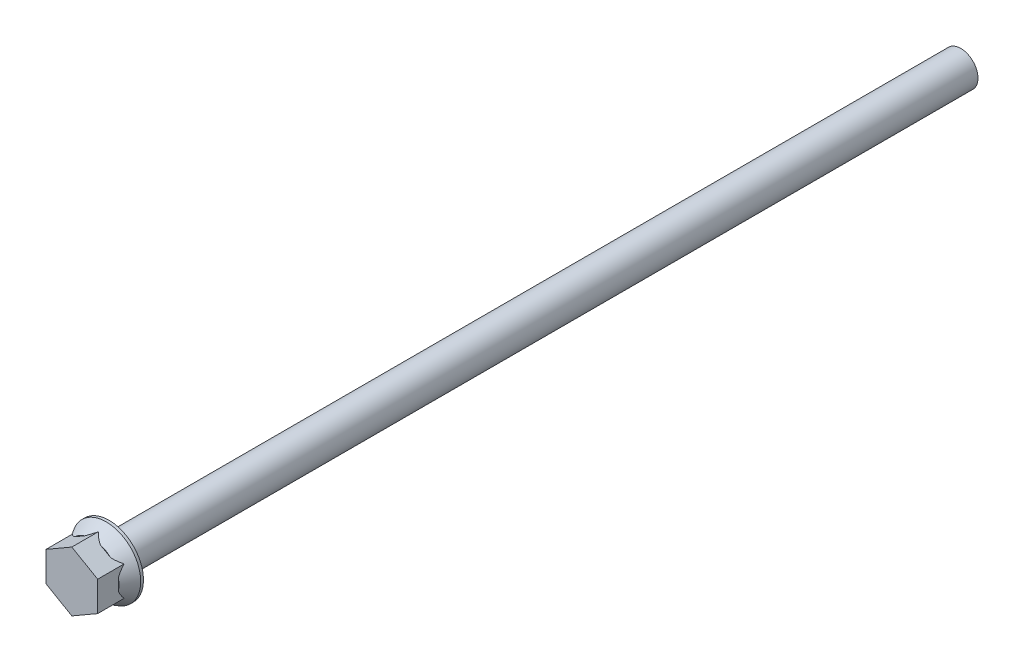
ISO-10303-21;
HEADER;
FILE_DESCRIPTION(('STEP AP214'),'2;1');
FILE_NAME('part.step','',(''),(''),'','','');
FILE_SCHEMA(('AUTOMOTIVE_DESIGN { 1 0 10303 214 1 1 1 1 }'));
ENDSEC;
DATA;
#1=APPLICATION_CONTEXT('core data for automotive mechanical design processes');
#2=APPLICATION_PROTOCOL_DEFINITION('international standard','automotive_design',2000,#1);
#3=PRODUCT_CONTEXT('',#1,'mechanical');
#4=PRODUCT('Part','Part','',(#3));
#5=PRODUCT_RELATED_PRODUCT_CATEGORY('part','',(#4));
#6=PRODUCT_DEFINITION_FORMATION('','',#4);
#7=PRODUCT_DEFINITION_CONTEXT('part definition',#1,'design');
#8=PRODUCT_DEFINITION('design','',#6,#7);
#9=PRODUCT_DEFINITION_SHAPE('','',#8);
#10=(LENGTH_UNIT() NAMED_UNIT(*) SI_UNIT(.MILLI.,.METRE.));
#11=(NAMED_UNIT(*) PLANE_ANGLE_UNIT() SI_UNIT($,.RADIAN.));
#12=(NAMED_UNIT(*) SI_UNIT($,.STERADIAN.) SOLID_ANGLE_UNIT());
#13=UNCERTAINTY_MEASURE_WITH_UNIT(LENGTH_MEASURE(1.E-05),#10,'distance_accuracy_value','');
#14=(GEOMETRIC_REPRESENTATION_CONTEXT(3) GLOBAL_UNCERTAINTY_ASSIGNED_CONTEXT((#13)) GLOBAL_UNIT_ASSIGNED_CONTEXT((#10,
#11,#12)) REPRESENTATION_CONTEXT('',''));
#15=CARTESIAN_POINT('',(0.,0.,0.));
#16=DIRECTION('',(0.,0.,1.));
#17=DIRECTION('',(1.,0.,0.));
#18=AXIS2_PLACEMENT_3D('',#15,#16,#17);
#19=CARTESIAN_POINT('',(0.,0.,3.048));
#20=DIRECTION('',(0.,0.,1.));
#21=DIRECTION('',(1.,0.,0.));
#22=AXIS2_PLACEMENT_3D('',#19,#20,#21);
#23=PLANE('',#22);
#24=DIRECTION('',(0.,1.,0.));
#25=VECTOR('',#24,1.);
#26=CARTESIAN_POINT('',(4.7625,-2.74963065701559,3.048));
#27=LINE('',#26,#25);
#28=CARTESIAN_POINT('',(4.7625,-1.08049160099193,3.048));
#29=VERTEX_POINT('',#28);
#30=CARTESIAN_POINT('',(4.7625,1.08049160099193,3.048));
#31=VERTEX_POINT('',#30);
#32=EDGE_CURVE('E140',#29,#31,#27,.T.);
#33=ORIENTED_EDGE('',*,*,#32,.F.);
#34=CARTESIAN_POINT('',(0.,0.,3.048));
#35=DIRECTION('',(0.,0.,1.));
#36=DIRECTION('',(1.,0.,0.));
#37=AXIS2_PLACEMENT_3D('',#34,#35,#36);
#38=CIRCLE('',#37,4.88353031625832);
#39=EDGE_CURVE('E168',#29,#31,#38,.T.);
#40=ORIENTED_EDGE('',*,*,#39,.T.);
#41=EDGE_LOOP('',(#33,#40));
#42=FACE_BOUND('',#41,.T.);
#43=ADVANCED_FACE('F32',(#42),#23,.T.);
#44=DIRECTION('',(-0.866025403784439,0.5,0.));
#45=VECTOR('',#44,1.);
#46=CARTESIAN_POINT('',(4.7625,2.74963065701559,3.048));
#47=LINE('',#46,#45);
#48=CARTESIAN_POINT('',(3.31698317503473,3.58420018502743,3.048));
#49=VERTEX_POINT('',#48);
#50=CARTESIAN_POINT('',(1.44551682496527,4.66469178601936,3.048));
#51=VERTEX_POINT('',#50);
#52=EDGE_CURVE('E365',#49,#51,#47,.T.);
#53=ORIENTED_EDGE('',*,*,#52,.F.);
#54=CARTESIAN_POINT('',(0.,0.,3.048));
#55=DIRECTION('',(0.,0.,1.));
#56=DIRECTION('',(1.,0.,0.));
#57=AXIS2_PLACEMENT_3D('',#54,#55,#56);
#58=CIRCLE('',#57,4.88353031625832);
#59=EDGE_CURVE('E166',#49,#51,#58,.T.);
#60=ORIENTED_EDGE('',*,*,#59,.T.);
#61=EDGE_LOOP('',(#53,#60));
#62=FACE_BOUND('',#61,.T.);
#63=ADVANCED_FACE('F313',(#62),#23,.T.);
#64=DIRECTION('',(-0.866025403784439,-0.5,0.));
#65=VECTOR('',#64,1.);
#66=CARTESIAN_POINT('',(0.,5.49926131403118,3.048));
#67=LINE('',#66,#65);
#68=CARTESIAN_POINT('',(-1.44551682496527,4.66469178601935,3.048));
#69=VERTEX_POINT('',#68);
#70=CARTESIAN_POINT('',(-3.31698317503473,3.58420018502742,3.048));
#71=VERTEX_POINT('',#70);
#72=EDGE_CURVE('E362',#69,#71,#67,.T.);
#73=ORIENTED_EDGE('',*,*,#72,.F.);
#74=CARTESIAN_POINT('',(0.,0.,3.048));
#75=DIRECTION('',(0.,0.,1.));
#76=DIRECTION('',(1.,0.,0.));
#77=AXIS2_PLACEMENT_3D('',#74,#75,#76);
#78=CIRCLE('',#77,4.88353031625832);
#79=EDGE_CURVE('E164',#69,#71,#78,.T.);
#80=ORIENTED_EDGE('',*,*,#79,.T.);
#81=EDGE_LOOP('',(#73,#80));
#82=FACE_BOUND('',#81,.T.);
#83=ADVANCED_FACE('F318',(#82),#23,.T.);
#84=DIRECTION('',(0.,-1.,0.));
#85=VECTOR('',#84,1.);
#86=CARTESIAN_POINT('',(-4.7625,2.74963065701559,3.048));
#87=LINE('',#86,#85);
#88=CARTESIAN_POINT('',(-4.7625,1.08049160099193,3.048));
#89=VERTEX_POINT('',#88);
#90=CARTESIAN_POINT('',(-4.7625,-1.08049160099193,3.048));
#91=VERTEX_POINT('',#90);
#92=EDGE_CURVE('E347',#89,#91,#87,.T.);
#93=ORIENTED_EDGE('',*,*,#92,.F.);
#94=CARTESIAN_POINT('',(0.,0.,3.048));
#95=DIRECTION('',(0.,0.,1.));
#96=DIRECTION('',(1.,0.,0.));
#97=AXIS2_PLACEMENT_3D('',#94,#95,#96);
#98=CIRCLE('',#97,4.88353031625832);
#99=EDGE_CURVE('E162',#89,#91,#98,.T.);
#100=ORIENTED_EDGE('',*,*,#99,.T.);
#101=EDGE_LOOP('',(#93,#100));
#102=FACE_BOUND('',#101,.T.);
#103=ADVANCED_FACE('F372',(#102),#23,.T.);
#104=DIRECTION('',(0.866025403784439,-0.5,0.));
#105=VECTOR('',#104,1.);
#106=CARTESIAN_POINT('',(-4.7625,-2.74963065701559,3.048));
#107=LINE('',#106,#105);
#108=CARTESIAN_POINT('',(-3.31698317503473,-3.58420018502743,3.048));
#109=VERTEX_POINT('',#108);
#110=CARTESIAN_POINT('',(-1.44551682496527,-4.66469178601935,3.048));
#111=VERTEX_POINT('',#110);
#112=EDGE_CURVE('E355',#109,#111,#107,.T.);
#113=ORIENTED_EDGE('',*,*,#112,.F.);
#114=CARTESIAN_POINT('',(0.,0.,3.048));
#115=DIRECTION('',(0.,0.,1.));
#116=DIRECTION('',(1.,0.,0.));
#117=AXIS2_PLACEMENT_3D('',#114,#115,#116);
#118=CIRCLE('',#117,4.88353031625832);
#119=EDGE_CURVE('E160',#109,#111,#118,.T.);
#120=ORIENTED_EDGE('',*,*,#119,.T.);
#121=EDGE_LOOP('',(#113,#120));
#122=FACE_BOUND('',#121,.T.);
#123=ADVANCED_FACE('F301',(#122),#23,.T.);
#124=DIRECTION('',(0.866025403784438,0.5,0.));
#125=VECTOR('',#124,1.);
#126=CARTESIAN_POINT('',(0.,-5.49926131403119,3.048));
#127=LINE('',#126,#125);
#128=CARTESIAN_POINT('',(1.44551682496528,-4.66469178601935,3.048));
#129=VERTEX_POINT('',#128);
#130=CARTESIAN_POINT('',(3.31698317503473,-3.58420018502743,3.048));
#131=VERTEX_POINT('',#130);
#132=EDGE_CURVE('E323',#129,#131,#127,.T.);
#133=ORIENTED_EDGE('',*,*,#132,.F.);
#134=CARTESIAN_POINT('',(0.,0.,3.048));
#135=DIRECTION('',(0.,0.,1.));
#136=DIRECTION('',(1.,0.,0.));
#137=AXIS2_PLACEMENT_3D('',#134,#135,#136);
#138=CIRCLE('',#137,4.88353031625832);
#139=EDGE_CURVE('E158',#129,#131,#138,.T.);
#140=ORIENTED_EDGE('',*,*,#139,.T.);
#141=EDGE_LOOP('',(#133,#140));
#142=FACE_BOUND('',#141,.T.);
#143=ADVANCED_FACE('F298',(#142),#23,.T.);
#144=CARTESIAN_POINT('',(0.,0.,-157.48));
#145=DIRECTION('',(0.,0.,1.));
#146=DIRECTION('',(1.,0.,0.));
#147=AXIS2_PLACEMENT_3D('',#144,#145,#146);
#148=CYLINDRICAL_SURFACE('',#147,3.175);
#149=CARTESIAN_POINT('',(0.,0.,-157.040059094878));
#150=DIRECTION('',(0.,0.,1.));
#151=DIRECTION('',(1.,0.,0.));
#152=AXIS2_PLACEMENT_3D('',#149,#150,#151);
#153=CIRCLE('',#152,3.175);
#154=CARTESIAN_POINT('',(3.175,0.,-157.040059094878));
#155=VERTEX_POINT('',#154);
#156=EDGE_CURVE('E40',#155,#155,#153,.T.);
#157=ORIENTED_EDGE('',*,*,#156,.T.);
#158=EDGE_LOOP('',(#157));
#159=FACE_BOUND('',#158,.T.);
#160=CARTESIAN_POINT('',(0.,0.,0.));
#161=DIRECTION('',(0.,0.,1.));
#162=DIRECTION('',(1.,0.,0.));
#163=AXIS2_PLACEMENT_3D('',#160,#161,#162);
#164=CIRCLE('',#163,3.175);
#165=CARTESIAN_POINT('',(3.175,0.,0.));
#166=VERTEX_POINT('',#165);
#167=EDGE_CURVE('E150',#166,#166,#164,.T.);
#168=ORIENTED_EDGE('',*,*,#167,.F.);
#169=EDGE_LOOP('',(#168));
#170=FACE_BOUND('',#169,.T.);
#171=ADVANCED_FACE('F34',(#159,#170),#148,.T.);
#172=CARTESIAN_POINT('',(0.,0.,-157.48));
#173=DIRECTION('',(0.,0.,1.));
#174=DIRECTION('',(1.,0.,0.));
#175=AXIS2_PLACEMENT_3D('',#172,#173,#174);
#176=PLANE('',#175);
#177=CARTESIAN_POINT('',(0.,0.,-157.48));
#178=DIRECTION('',(0.,0.,1.));
#179=DIRECTION('',(1.,0.,0.));
#180=AXIS2_PLACEMENT_3D('',#177,#178,#179);
#181=CIRCLE('',#180,2.413);
#182=CARTESIAN_POINT('',(2.413,0.,-157.48));
#183=VERTEX_POINT('',#182);
#184=EDGE_CURVE('E11',#183,#183,#181,.F.);
#185=ORIENTED_EDGE('',*,*,#184,.T.);
#186=EDGE_LOOP('',(#185));
#187=FACE_BOUND('',#186,.T.);
#188=ADVANCED_FACE('F304',(#187),#176,.F.);
#189=CARTESIAN_POINT('',(0.,0.,3.048));
#190=DIRECTION('',(0.,0.,-1.));
#191=DIRECTION('',(-1.,0.,0.));
#192=AXIS2_PLACEMENT_3D('',#189,#190,#191);
#193=CYLINDRICAL_SURFACE('',#192,6.35);
#194=CARTESIAN_POINT('',(0.,0.,0.507999999999989));
#195=DIRECTION('',(0.,0.,1.));
#196=DIRECTION('',(1.,0.,0.));
#197=AXIS2_PLACEMENT_3D('',#194,#195,#196);
#198=CIRCLE('',#197,6.35);
#199=CARTESIAN_POINT('',(-6.35,0.,0.507999999999989));
#200=VERTEX_POINT('',#199);
#201=EDGE_CURVE('E171',#200,#200,#198,.F.);
#202=CARTESIAN_POINT('',(0.,0.,0.));
#203=DIRECTION('',(0.,0.,1.));
#204=DIRECTION('',(1.,0.,0.));
#205=AXIS2_PLACEMENT_3D('',#202,#203,#204);
#206=CIRCLE('',#205,6.35);
#207=CARTESIAN_POINT('',(-6.35,0.,0.));
#208=VERTEX_POINT('',#207);
#209=EDGE_CURVE('E147',#208,#208,#206,.T.);
#210=CARTESIAN_POINT('',(-6.35,0.,0.507999999999989));
#211=CARTESIAN_POINT('',(-6.35,0.,0.502708333333323));
#212=CARTESIAN_POINT('',(-6.35,0.,0.497416666666656));
#213=CARTESIAN_POINT('',(-6.35,0.,0.486833333333323));
#214=CARTESIAN_POINT('',(-6.35,0.,0.481541666666657));
#215=CARTESIAN_POINT('',(-6.35,0.,0.470958333333323));
#216=CARTESIAN_POINT('',(-6.35,0.,0.465666666666657));
#217=CARTESIAN_POINT('',(-6.35,0.,0.455083333333324));
#218=CARTESIAN_POINT('',(-6.35,0.,0.449791666666657));
#219=CARTESIAN_POINT('',(-6.35,0.,0.439208333333324));
#220=CARTESIAN_POINT('',(-6.35,0.,0.433916666666658));
#221=CARTESIAN_POINT('',(-6.35,0.,0.423333333333324));
#222=CARTESIAN_POINT('',(-6.35,0.,0.418041666666658));
#223=CARTESIAN_POINT('',(-6.35,0.,0.407458333333325));
#224=CARTESIAN_POINT('',(-6.35,0.,0.402166666666658));
#225=CARTESIAN_POINT('',(-6.35,0.,0.391583333333325));
#226=CARTESIAN_POINT('',(-6.35,0.,0.386291666666659));
#227=CARTESIAN_POINT('',(-6.35,0.,0.375708333333325));
#228=CARTESIAN_POINT('',(-6.35,0.,0.370416666666659));
#229=CARTESIAN_POINT('',(-6.35,0.,0.359833333333326));
#230=CARTESIAN_POINT('',(-6.35,0.,0.354541666666659));
#231=CARTESIAN_POINT('',(-6.35,0.,0.343958333333326));
#232=CARTESIAN_POINT('',(-6.35,0.,0.33866666666666));
#233=CARTESIAN_POINT('',(-6.35,0.,0.328083333333326));
#234=CARTESIAN_POINT('',(-6.35,0.,0.32279166666666));
#235=CARTESIAN_POINT('',(-6.35,0.,0.312208333333327));
#236=CARTESIAN_POINT('',(-6.35,0.,0.30691666666666));
#237=CARTESIAN_POINT('',(-6.35,0.,0.296333333333327));
#238=CARTESIAN_POINT('',(-6.35,0.,0.291041666666661));
#239=CARTESIAN_POINT('',(-6.35,0.,0.280458333333327));
#240=CARTESIAN_POINT('',(-6.35,0.,0.275166666666661));
#241=CARTESIAN_POINT('',(-6.35,0.,0.264583333333328));
#242=CARTESIAN_POINT('',(-6.35,0.,0.259291666666661));
#243=CARTESIAN_POINT('',(-6.35,0.,0.248708333333328));
#244=CARTESIAN_POINT('',(-6.35,0.,0.243416666666661));
#245=CARTESIAN_POINT('',(-6.35,0.,0.232833333333328));
#246=CARTESIAN_POINT('',(-6.35,0.,0.227541666666662));
#247=CARTESIAN_POINT('',(-6.35,0.,0.216958333333329));
#248=CARTESIAN_POINT('',(-6.35,0.,0.211666666666662));
#249=CARTESIAN_POINT('',(-6.35,0.,0.201083333333329));
#250=CARTESIAN_POINT('',(-6.35,0.,0.195791666666663));
#251=CARTESIAN_POINT('',(-6.35,0.,0.18520833333333));
#252=CARTESIAN_POINT('',(-6.35,0.,0.179916666666663));
#253=CARTESIAN_POINT('',(-6.35,0.,0.16933333333333));
#254=CARTESIAN_POINT('',(-6.35,0.,0.164041666666663));
#255=CARTESIAN_POINT('',(-6.35,0.,0.15345833333333));
#256=CARTESIAN_POINT('',(-6.35,0.,0.148166666666664));
#257=CARTESIAN_POINT('',(-6.35,0.,0.137583333333331));
#258=CARTESIAN_POINT('',(-6.35,0.,0.132291666666664));
#259=CARTESIAN_POINT('',(-6.35,0.,0.121708333333331));
#260=CARTESIAN_POINT('',(-6.35,0.,0.116416666666664));
#261=CARTESIAN_POINT('',(-6.35,0.,0.105833333333331));
#262=CARTESIAN_POINT('',(-6.35,0.,0.100541666666665));
#263=CARTESIAN_POINT('',(-6.35,0.,0.0899583333333315));
#264=CARTESIAN_POINT('',(-6.35,0.,0.0846666666666649));
#265=CARTESIAN_POINT('',(-6.35,0.,0.0740833333333317));
#266=CARTESIAN_POINT('',(-6.35,0.,0.0687916666666651));
#267=CARTESIAN_POINT('',(-6.35,0.,0.058208333333332));
#268=CARTESIAN_POINT('',(-6.35,0.,0.0529166666666655));
#269=CARTESIAN_POINT('',(-6.35,0.,0.0423333333333324));
#270=CARTESIAN_POINT('',(-6.35,0.,0.0370416666666658));
#271=CARTESIAN_POINT('',(-6.35,0.,0.0264583333333326));
#272=CARTESIAN_POINT('',(-6.35,0.,0.021166666666666));
#273=CARTESIAN_POINT('',(-6.35,0.,0.0105833333333329));
#274=CARTESIAN_POINT('',(-6.35,0.,0.00529166666666647));
#275=CARTESIAN_POINT('',(-6.35,0.,0.));
#276=B_SPLINE_CURVE_WITH_KNOTS('',3,(#210,#211,#212,#213,#214,#215,#216,#217,#218,#219,#220,
#221,#222,#223,#224,#225,#226,#227,#228,#229,#230,#231,#232,#233,#234,#235,#236,#237,#238,#239,
#240,#241,#242,#243,#244,#245,#246,#247,#248,#249,#250,#251,#252,#253,#254,#255,#256,#257,#258,
#259,#260,#261,#262,#263,#264,#265,#266,#267,#268,#269,#270,#271,#272,#273,#274,#275),
.UNSPECIFIED.,.F.,.F.,(4,2,2,2,2,2,2,2,2,2,2,2,2,2,2,2,2,2,2,2,2,2,2,2,2,2,2,2,2,2,2,2,4),(0.,
0.0158749999999998,0.0317499999999992,0.0476249999999991,0.0634999999999984,0.0793749999999983,
0.0952499999999981,0.111124999999998,0.126999999999997,0.142874999999997,0.158749999999997,
0.174624999999996,0.190499999999996,0.206374999999996,0.222249999999995,0.238124999999995,
0.253999999999995,0.269874999999995,0.285749999999994,0.301624999999994,0.317499999999993,
0.333374999999993,0.349249999999993,0.365124999999992,0.380999999999992,0.396874999999992,
0.412749999999991,0.428624999999991,0.444499999999991,0.46037499999999,0.47624999999999,
0.49212499999999,0.507999999999989),.UNSPECIFIED.);
#277=EDGE_CURVE('BSEAM296',#200,#208,#276,.T.);
#278=ORIENTED_EDGE('',*,*,#201,.T.);
#279=ORIENTED_EDGE('',*,*,#209,.T.);
#280=ORIENTED_EDGE('',*,*,#277,.T.);
#281=ORIENTED_EDGE('',*,*,#277,.F.);
#282=EDGE_LOOP('',(#278,#280,#279,#281));
#283=FACE_BOUND('',#282,.T.);
#284=ADVANCED_FACE('F296',(#283),#193,.T.);
#285=CARTESIAN_POINT('',(0.,0.,0.));
#286=DIRECTION('',(0.,0.,1.));
#287=DIRECTION('',(1.,0.,0.));
#288=AXIS2_PLACEMENT_3D('',#285,#286,#287);
#289=PLANE('',#288);
#290=ORIENTED_EDGE('',*,*,#167,.T.);
#291=EDGE_LOOP('',(#290));
#292=FACE_BOUND('',#291,.T.);
#293=ORIENTED_EDGE('',*,*,#209,.F.);
#294=EDGE_LOOP('',(#293));
#295=FACE_BOUND('',#294,.T.);
#296=ADVANCED_FACE('F292',(#292,#295),#289,.F.);
#297=CARTESIAN_POINT('',(4.7625,2.74963065701559,6.858));
#298=DIRECTION('',(-0.5,-0.866025403784439,0.));
#299=DIRECTION('',(0.866025403784439,-0.5,0.));
#300=AXIS2_PLACEMENT_3D('',#297,#298,#299);
#301=PLANE('',#300);
#302=DIRECTION('',(0.,0.,-1.));
#303=VECTOR('',#302,1.);
#304=CARTESIAN_POINT('',(4.7625,2.74963065701559,6.858));
#305=LINE('',#304,#303);
#306=CARTESIAN_POINT('',(4.7625,2.74963065701559,6.858));
#307=VERTEX_POINT('',#306);
#308=CARTESIAN_POINT('',(4.7625,2.74963065701559,1.98152262806234));
#309=VERTEX_POINT('',#308);
#310=EDGE_CURVE('E330',#307,#309,#305,.T.);
#311=ORIENTED_EDGE('',*,*,#310,.T.);
#312=CARTESIAN_POINT('',(4.7625,2.74963065701559,1.98152262806233));
#313=CARTESIAN_POINT('',(4.70806850555839,2.78105669498385,2.03594733889557));
#314=CARTESIAN_POINT('',(4.65304248325209,2.81282598377483,2.08958145458752));
#315=CARTESIAN_POINT('',(4.54166523548858,2.87712966775269,2.19501656144948));
#316=CARTESIAN_POINT('',(4.48531365415453,2.90966426840517,2.24681705077103));
#317=CARTESIAN_POINT('',(4.31496585347538,3.00801461698313,2.39828607008314));
#318=CARTESIAN_POINT('',(4.19886449962742,3.07504576488054,2.49484535241177));
#319=CARTESIAN_POINT('',(3.95986384686173,3.2130328560913,2.67683384427265));
#320=CARTESIAN_POINT('',(3.83695279921296,3.28399558253769,2.76224290714216));
#321=CARTESIAN_POINT('',(3.64673737285705,3.3938165101483,2.87892827110122));
#322=CARTESIAN_POINT('',(3.58211247749427,3.43112771088235,2.91603213293233));
#323=CARTESIAN_POINT('',(3.45096317293374,3.5068467971744,2.98564467647192));
#324=CARTESIAN_POINT('',(3.38443700087395,3.54525570052128,3.01814891553764));
#325=CARTESIAN_POINT('',(3.31698317503493,3.58420018502731,3.04800000000027));
#326=B_SPLINE_CURVE_WITH_KNOTS('',3,(#312,#313,#314,#315,#316,#317,#318,#319,#320,#321,#322,
#323,#324,#325),.UNSPECIFIED.,.F.,.F.,(4,2,2,2,2,2,4),(0.,0.249414801006935,0.498897345140642,
0.994125435248173,1.49023629141916,1.74010940185473,1.99022223384641),.UNSPECIFIED.);
#327=EDGE_CURVE('E183',#309,#49,#326,.T.);
#328=ORIENTED_EDGE('',*,*,#327,.T.);
#329=ORIENTED_EDGE('',*,*,#52,.T.);
#330=CARTESIAN_POINT('',(1.44551682496527,4.66469178601936,3.048));
#331=CARTESIAN_POINT('',(1.33275800160676,4.72979312303889,2.9980404274385));
#332=CARTESIAN_POINT('',(1.22267791970979,4.79334788795452,2.94081151769288));
#333=CARTESIAN_POINT('',(1.00792804934776,4.91733378341648,2.8148056037219));
#334=CARTESIAN_POINT('',(0.903244341630222,4.97777295024697,2.74606047727585));
#335=CARTESIAN_POINT('',(0.699688670339999,5.09529587186145,2.60039696437267));
#336=CARTESIAN_POINT('',(0.600771363673436,5.15240580549291,2.52356138868698));
#337=CARTESIAN_POINT('',(0.407106469894921,5.26421828404851,2.36310460038256));
#338=CARTESIAN_POINT('',(0.312360800739533,5.31891972163993,2.2794803158026));
#339=CARTESIAN_POINT('',(0.182358555383388,5.39397655299155,2.15877377677643));
#340=CARTESIAN_POINT('',(0.145542982316677,5.41523203401199,2.12389687098996));
#341=CARTESIAN_POINT('',(0.0723971643891195,5.45746279168256,2.05330563723714));
#342=CARTESIAN_POINT('',(0.0360680009984946,5.47843744394557,2.01758981439869));
#343=CARTESIAN_POINT('',(0.,5.4992613140312,1.98152262806239));
#344=B_SPLINE_CURVE_WITH_KNOTS('',3,(#330,#331,#332,#333,#334,#335,#336,#337,#338,#339,#340,
#341,#342,#343),.UNSPECIFIED.,.F.,.F.,(4,2,2,2,2,2,4),(0.,0.417745838932871,0.834353874819421,
1.24704985306053,1.65993363275569,1.82488913196575,1.99016500571261),.UNSPECIFIED.);
#345=CARTESIAN_POINT('',(0.,5.49926131403118,1.98152262806234));
#346=VERTEX_POINT('',#345);
#347=EDGE_CURVE('E145',#51,#346,#344,.T.);
#348=ORIENTED_EDGE('',*,*,#347,.T.);
#349=DIRECTION('',(0.,0.,-1.));
#350=VECTOR('',#349,1.);
#351=CARTESIAN_POINT('',(0.,5.49926131403118,6.858));
#352=LINE('',#351,#350);
#353=CARTESIAN_POINT('',(0.,5.49926131403118,6.858));
#354=VERTEX_POINT('',#353);
#355=EDGE_CURVE('E126',#354,#346,#352,.T.);
#356=ORIENTED_EDGE('',*,*,#355,.F.);
#357=DIRECTION('',(-0.866025403784439,0.5,0.));
#358=VECTOR('',#357,1.);
#359=CARTESIAN_POINT('',(4.7625,2.74963065701559,6.858));
#360=LINE('',#359,#358);
#361=EDGE_CURVE('E133',#307,#354,#360,.T.);
#362=ORIENTED_EDGE('',*,*,#361,.F.);
#363=EDGE_LOOP('',(#311,#328,#329,#348,#356,#362));
#364=FACE_BOUND('',#363,.T.);
#365=ADVANCED_FACE('F142',(#364),#301,.F.);
#366=CARTESIAN_POINT('',(0.,5.49926131403118,6.858));
#367=DIRECTION('',(0.5,-0.866025403784439,0.));
#368=DIRECTION('',(0.866025403784439,0.5,0.));
#369=AXIS2_PLACEMENT_3D('',#366,#367,#368);
#370=PLANE('',#369);
#371=ORIENTED_EDGE('',*,*,#355,.T.);
#372=CARTESIAN_POINT('',(0.,5.49926131403118,1.98152262806234));
#373=CARTESIAN_POINT('',(-0.0544314944416095,5.46783527606293,2.03594733889557));
#374=CARTESIAN_POINT('',(-0.109457516747909,5.43606598727195,2.08958145458752));
#375=CARTESIAN_POINT('',(-0.220834764511426,5.37176230329409,2.19501656144948));
#376=CARTESIAN_POINT('',(-0.277186345845472,5.33922770264161,2.24681705077104));
#377=CARTESIAN_POINT('',(-0.447534146524622,5.24087735406365,2.39828607008314));
#378=CARTESIAN_POINT('',(-0.563635500372585,5.17384620616625,2.49484535241177));
#379=CARTESIAN_POINT('',(-0.802636153138272,5.03585911495548,2.67683384427265));
#380=CARTESIAN_POINT('',(-0.925547200787037,4.96489638850908,2.76224290714216));
#381=CARTESIAN_POINT('',(-1.11576262714295,4.85507546089848,2.87892827110122));
#382=CARTESIAN_POINT('',(-1.18038752250573,4.81776426016443,2.91603213293233));
#383=CARTESIAN_POINT('',(-1.31153682706626,4.74204517387237,2.98564467647192));
#384=CARTESIAN_POINT('',(-1.37806299912605,4.7036362705255,3.01814891553764));
#385=CARTESIAN_POINT('',(-1.44551682496507,4.66469178601947,3.04800000000027));
#386=B_SPLINE_CURVE_WITH_KNOTS('',3,(#372,#373,#374,#375,#376,#377,#378,#379,#380,#381,#382,
#383,#384,#385),.UNSPECIFIED.,.F.,.F.,(4,2,2,2,2,2,4),(0.,0.249414801006933,0.49889734514064,
0.99412543524817,1.49023629141916,1.74010940185473,1.99022223384641),.UNSPECIFIED.);
#387=EDGE_CURVE('E212',#346,#69,#386,.T.);
#388=ORIENTED_EDGE('',*,*,#387,.T.);
#389=ORIENTED_EDGE('',*,*,#72,.T.);
#390=CARTESIAN_POINT('',(-3.31698317503473,3.58420018502742,3.048));
#391=CARTESIAN_POINT('',(-3.42974199839324,3.51909884800788,2.9980404274385));
#392=CARTESIAN_POINT('',(-3.53982208029021,3.45554408309225,2.94081151769288));
#393=CARTESIAN_POINT('',(-3.75457195065224,3.3315581876303,2.8148056037219));
#394=CARTESIAN_POINT('',(-3.85925565836978,3.27111902079981,2.74606047727585));
#395=CARTESIAN_POINT('',(-4.06281132966,3.15359609918532,2.60039696437267));
#396=CARTESIAN_POINT('',(-4.16172863632656,3.09648616555387,2.52356138868698));
#397=CARTESIAN_POINT('',(-4.35539353010508,2.98467368699826,2.36310460038256));
#398=CARTESIAN_POINT('',(-4.45013919926046,2.92997224940685,2.2794803158026));
#399=CARTESIAN_POINT('',(-4.58014144461661,2.85491541805522,2.15877377677643));
#400=CARTESIAN_POINT('',(-4.61695701768332,2.83365993703479,2.12389687098996));
#401=CARTESIAN_POINT('',(-4.69010283561088,2.79142917936422,2.05330563723713));
#402=CARTESIAN_POINT('',(-4.7264319990015,2.77045452710121,2.01758981439868));
#403=CARTESIAN_POINT('',(-4.76250000000003,2.74963065701557,1.98152262806239));
#404=B_SPLINE_CURVE_WITH_KNOTS('',3,(#390,#391,#392,#393,#394,#395,#396,#397,#398,#399,#400,
#401,#402,#403),.UNSPECIFIED.,.F.,.F.,(4,2,2,2,2,2,4),(0.,0.417745838932871,0.834353874819422,
1.24704985306053,1.65993363275569,1.82488913196575,1.99016500571261),.UNSPECIFIED.);
#405=CARTESIAN_POINT('',(-4.7625,2.74963065701559,1.98152262806234));
#406=VERTEX_POINT('',#405);
#407=EDGE_CURVE('E220',#71,#406,#404,.T.);
#408=ORIENTED_EDGE('',*,*,#407,.T.);
#409=DIRECTION('',(0.,0.,-1.));
#410=VECTOR('',#409,1.);
#411=CARTESIAN_POINT('',(-4.7625,2.74963065701559,6.858));
#412=LINE('',#411,#410);
#413=CARTESIAN_POINT('',(-4.7625,2.74963065701559,6.858));
#414=VERTEX_POINT('',#413);
#415=EDGE_CURVE('E129',#414,#406,#412,.T.);
#416=ORIENTED_EDGE('',*,*,#415,.F.);
#417=DIRECTION('',(-0.866025403784439,-0.5,0.));
#418=VECTOR('',#417,1.);
#419=CARTESIAN_POINT('',(0.,5.49926131403118,6.858));
#420=LINE('',#419,#418);
#421=EDGE_CURVE('E122',#354,#414,#420,.T.);
#422=ORIENTED_EDGE('',*,*,#421,.F.);
#423=EDGE_LOOP('',(#371,#388,#389,#408,#416,#422));
#424=FACE_BOUND('',#423,.T.);
#425=ADVANCED_FACE('F124',(#424),#370,.F.);
#426=CARTESIAN_POINT('',(-4.7625,2.74963065701559,6.858));
#427=DIRECTION('',(1.,0.,0.));
#428=DIRECTION('',(0.,1.,0.));
#429=AXIS2_PLACEMENT_3D('',#426,#427,#428);
#430=PLANE('',#429);
#431=ORIENTED_EDGE('',*,*,#415,.T.);
#432=CARTESIAN_POINT('',(-4.7625,2.74963065701559,1.98152262806234));
#433=CARTESIAN_POINT('',(-4.7625,2.68677858107908,2.03594733889557));
#434=CARTESIAN_POINT('',(-4.7625,2.62324000349713,2.08958145458752));
#435=CARTESIAN_POINT('',(-4.7625,2.4946326355414,2.19501656144948));
#436=CARTESIAN_POINT('',(-4.7625,2.42956343423645,2.24681705077103));
#437=CARTESIAN_POINT('',(-4.7625,2.23286273708051,2.39828607008314));
#438=CARTESIAN_POINT('',(-4.7625,2.09880044128571,2.49484535241177));
#439=CARTESIAN_POINT('',(-4.7625,1.82282625886418,2.67683384427265));
#440=CARTESIAN_POINT('',(-4.7625,1.68090080597139,2.76224290714216));
#441=CARTESIAN_POINT('',(-4.7625,1.46125895075019,2.87892827110122));
#442=CARTESIAN_POINT('',(-4.7625,1.38663654928208,2.91603213293233));
#443=CARTESIAN_POINT('',(-4.7625,1.23519837669797,2.98564467647192));
#444=CARTESIAN_POINT('',(-4.7625,1.15838057000422,3.01814891553764));
#445=CARTESIAN_POINT('',(-4.7625,1.08049160099216,3.04800000000027));
#446=B_SPLINE_CURVE_WITH_KNOTS('',3,(#432,#433,#434,#435,#436,#437,#438,#439,#440,#441,#442,
#443,#444,#445),.UNSPECIFIED.,.F.,.F.,(4,2,2,2,2,2,4),(0.,0.249414801006933,0.498897345140639,
0.994125435248169,1.49023629141916,1.74010940185473,1.9902222338464),.UNSPECIFIED.);
#447=EDGE_CURVE('E227',#406,#89,#446,.T.);
#448=ORIENTED_EDGE('',*,*,#447,.T.);
#449=ORIENTED_EDGE('',*,*,#92,.T.);
#450=CARTESIAN_POINT('',(-4.7625,-1.08049160099193,3.048));
#451=CARTESIAN_POINT('',(-4.7625,-1.21069427503101,2.9980404274385));
#452=CARTESIAN_POINT('',(-4.7625,-1.33780380486227,2.94081151769288));
#453=CARTESIAN_POINT('',(-4.7625,-1.58577559578618,2.8148056037219));
#454=CARTESIAN_POINT('',(-4.7625,-1.70665392944716,2.74606047727585));
#455=CARTESIAN_POINT('',(-4.7625,-1.94169977267613,2.60039696437267));
#456=CARTESIAN_POINT('',(-4.7625,-2.05591963993903,2.52356138868698));
#457=CARTESIAN_POINT('',(-4.7625,-2.27954459705025,2.36310460038256));
#458=CARTESIAN_POINT('',(-4.7625,-2.38894747223307,2.2794803158026));
#459=CARTESIAN_POINT('',(-4.7625,-2.53906113493633,2.15877377677643));
#460=CARTESIAN_POINT('',(-4.7625,-2.5815720969772,2.12389687098996));
#461=CARTESIAN_POINT('',(-4.7625,-2.66603361231834,2.05330563723713));
#462=CARTESIAN_POINT('',(-4.7625,-2.70798291684437,2.01758981439868));
#463=CARTESIAN_POINT('',(-4.7625,-2.74963065701563,1.98152262806238));
#464=B_SPLINE_CURVE_WITH_KNOTS('',3,(#450,#451,#452,#453,#454,#455,#456,#457,#458,#459,#460,
#461,#462,#463),.UNSPECIFIED.,.F.,.F.,(4,2,2,2,2,2,4),(0.,0.417745838932871,0.834353874819421,
1.24704985306053,1.65993363275569,1.82488913196575,1.99016500571262),.UNSPECIFIED.);
#465=CARTESIAN_POINT('',(-4.7625,-2.74963065701559,1.98152262806234));
#466=VERTEX_POINT('',#465);
#467=EDGE_CURVE('E235',#91,#466,#464,.T.);
#468=ORIENTED_EDGE('',*,*,#467,.T.);
#469=DIRECTION('',(0.,0.,-1.));
#470=VECTOR('',#469,1.);
#471=CARTESIAN_POINT('',(-4.7625,-2.74963065701559,6.858));
#472=LINE('',#471,#470);
#473=CARTESIAN_POINT('',(-4.7625,-2.74963065701559,6.858));
#474=VERTEX_POINT('',#473);
#475=EDGE_CURVE('E152',#474,#466,#472,.T.);
#476=ORIENTED_EDGE('',*,*,#475,.F.);
#477=DIRECTION('',(0.,-1.,0.));
#478=VECTOR('',#477,1.);
#479=CARTESIAN_POINT('',(-4.7625,2.74963065701559,6.858));
#480=LINE('',#479,#478);
#481=EDGE_CURVE('E132',#414,#474,#480,.T.);
#482=ORIENTED_EDGE('',*,*,#481,.F.);
#483=EDGE_LOOP('',(#431,#448,#449,#468,#476,#482));
#484=FACE_BOUND('',#483,.T.);
#485=ADVANCED_FACE('F279',(#484),#430,.F.);
#486=CARTESIAN_POINT('',(-4.7625,-2.74963065701559,6.858));
#487=DIRECTION('',(0.5,0.866025403784439,0.));
#488=DIRECTION('',(-0.866025403784439,0.5,0.));
#489=AXIS2_PLACEMENT_3D('',#486,#487,#488);
#490=PLANE('',#489);
#491=ORIENTED_EDGE('',*,*,#475,.T.);
#492=CARTESIAN_POINT('',(-4.7625,-2.74963065701559,1.98152262806233));
#493=CARTESIAN_POINT('',(-4.70806850555839,-2.78105669498385,2.03594733889557));
#494=CARTESIAN_POINT('',(-4.65304248325209,-2.81282598377483,2.08958145458752));
#495=CARTESIAN_POINT('',(-4.54166523548858,-2.87712966775269,2.19501656144948));
#496=CARTESIAN_POINT('',(-4.48531365415453,-2.90966426840517,2.24681705077103));
#497=CARTESIAN_POINT('',(-4.31496585347538,-3.00801461698313,2.39828607008314));
#498=CARTESIAN_POINT('',(-4.19886449962742,-3.07504576488054,2.49484535241177));
#499=CARTESIAN_POINT('',(-3.95986384686173,-3.2130328560913,2.67683384427265));
#500=CARTESIAN_POINT('',(-3.83695279921296,-3.2839955825377,2.76224290714216));
#501=CARTESIAN_POINT('',(-3.64673737285705,-3.3938165101483,2.87892827110122));
#502=CARTESIAN_POINT('',(-3.58211247749427,-3.43112771088235,2.91603213293233));
#503=CARTESIAN_POINT('',(-3.45096317293374,-3.50684679717441,2.98564467647192));
#504=CARTESIAN_POINT('',(-3.38443700087395,-3.54525570052128,3.01814891553764));
#505=CARTESIAN_POINT('',(-3.31698317503493,-3.58420018502731,3.04800000000027));
#506=B_SPLINE_CURVE_WITH_KNOTS('',3,(#492,#493,#494,#495,#496,#497,#498,#499,#500,#501,#502,
#503,#504,#505),.UNSPECIFIED.,.F.,.F.,(4,2,2,2,2,2,4),(0.,0.249414801006934,0.498897345140641,
0.994125435248174,1.49023629141916,1.74010940185474,1.99022223384641),.UNSPECIFIED.);
#507=EDGE_CURVE('E242',#466,#109,#506,.T.);
#508=ORIENTED_EDGE('',*,*,#507,.T.);
#509=ORIENTED_EDGE('',*,*,#112,.T.);
#510=CARTESIAN_POINT('',(-1.44551682496527,-4.66469178601935,3.048));
#511=CARTESIAN_POINT('',(-1.33275800160677,-4.72979312303889,2.9980404274385));
#512=CARTESIAN_POINT('',(-1.2226779197098,-4.79334788795452,2.94081151769288));
#513=CARTESIAN_POINT('',(-1.00792804934776,-4.91733378341648,2.8148056037219));
#514=CARTESIAN_POINT('',(-0.903244341630228,-4.97777295024697,2.74606047727585));
#515=CARTESIAN_POINT('',(-0.699688670340005,-5.09529587186145,2.60039696437267));
#516=CARTESIAN_POINT('',(-0.600771363673442,-5.15240580549291,2.52356138868698));
#517=CARTESIAN_POINT('',(-0.407106469894926,-5.26421828404851,2.36310460038256));
#518=CARTESIAN_POINT('',(-0.312360800739539,-5.31891972163993,2.27948031580261));
#519=CARTESIAN_POINT('',(-0.182358555383393,-5.39397655299155,2.15877377677643));
#520=CARTESIAN_POINT('',(-0.145542982316681,-5.41523203401199,2.12389687098996));
#521=CARTESIAN_POINT('',(-0.0723971643891214,-5.45746279168256,2.05330563723713));
#522=CARTESIAN_POINT('',(-0.0360680009984957,-5.47843744394557,2.01758981439868));
#523=CARTESIAN_POINT('',(0.,-5.49926131403121,1.98152262806238));
#524=B_SPLINE_CURVE_WITH_KNOTS('',3,(#510,#511,#512,#513,#514,#515,#516,#517,#518,#519,#520,
#521,#522,#523),.UNSPECIFIED.,.F.,.F.,(4,2,2,2,2,2,4),(0.,0.41774583893287,0.834353874819421,
1.24704985306053,1.65993363275569,1.82488913196575,1.99016500571262),.UNSPECIFIED.);
#525=CARTESIAN_POINT('',(0.,-5.49926131403119,1.98152262806234));
#526=VERTEX_POINT('',#525);
#527=EDGE_CURVE('E250',#111,#526,#524,.T.);
#528=ORIENTED_EDGE('',*,*,#527,.T.);
#529=DIRECTION('',(0.,0.,-1.));
#530=VECTOR('',#529,1.);
#531=CARTESIAN_POINT('',(0.,-5.49926131403119,6.858));
#532=LINE('',#531,#530);
#533=CARTESIAN_POINT('',(0.,-5.49926131403119,6.858));
#534=VERTEX_POINT('',#533);
#535=EDGE_CURVE('E55',#534,#526,#532,.T.);
#536=ORIENTED_EDGE('',*,*,#535,.F.);
#537=DIRECTION('',(0.866025403784439,-0.5,0.));
#538=VECTOR('',#537,1.);
#539=CARTESIAN_POINT('',(-4.7625,-2.74963065701559,6.858));
#540=LINE('',#539,#538);
#541=EDGE_CURVE('E343',#474,#534,#540,.T.);
#542=ORIENTED_EDGE('',*,*,#541,.F.);
#543=EDGE_LOOP('',(#491,#508,#509,#528,#536,#542));
#544=FACE_BOUND('',#543,.T.);
#545=ADVANCED_FACE('F275',(#544),#490,.F.);
#546=CARTESIAN_POINT('',(0.,-5.49926131403119,6.858));
#547=DIRECTION('',(-0.5,0.866025403784438,0.));
#548=DIRECTION('',(-0.866025403784439,-0.5,0.));
#549=AXIS2_PLACEMENT_3D('',#546,#547,#548);
#550=PLANE('',#549);
#551=ORIENTED_EDGE('',*,*,#535,.T.);
#552=CARTESIAN_POINT('',(0.,-5.49926131403119,1.98152262806233));
#553=CARTESIAN_POINT('',(0.0544314944416094,-5.46783527606293,2.03594733889557));
#554=CARTESIAN_POINT('',(0.109457516747909,-5.43606598727196,2.08958145458752));
#555=CARTESIAN_POINT('',(0.220834764511427,-5.37176230329409,2.19501656144948));
#556=CARTESIAN_POINT('',(0.277186345845474,-5.33922770264162,2.24681705077103));
#557=CARTESIAN_POINT('',(0.447534146524625,-5.24087735406365,2.39828607008314));
#558=CARTESIAN_POINT('',(0.563635500372589,-5.17384620616625,2.49484535241177));
#559=CARTESIAN_POINT('',(0.802636153138276,-5.03585911495548,2.67683384427265));
#560=CARTESIAN_POINT('',(0.925547200787042,-4.96489638850908,2.76224290714216));
#561=CARTESIAN_POINT('',(1.11576262714295,-4.85507546089848,2.87892827110122));
#562=CARTESIAN_POINT('',(1.18038752250573,-4.81776426016443,2.91603213293233));
#563=CARTESIAN_POINT('',(1.31153682706626,-4.74204517387237,2.98564467647192));
#564=CARTESIAN_POINT('',(1.37806299912606,-4.7036362705255,3.01814891553764));
#565=CARTESIAN_POINT('',(1.44551682496508,-4.66469178601947,3.04800000000027));
#566=B_SPLINE_CURVE_WITH_KNOTS('',3,(#552,#553,#554,#555,#556,#557,#558,#559,#560,#561,#562,
#563,#564,#565),.UNSPECIFIED.,.F.,.F.,(4,2,2,2,2,2,4),(0.,0.249414801006935,0.498897345140643,
0.994125435248175,1.49023629141917,1.74010940185474,1.99022223384642),.UNSPECIFIED.);
#567=EDGE_CURVE('E256',#526,#129,#566,.T.);
#568=ORIENTED_EDGE('',*,*,#567,.T.);
#569=ORIENTED_EDGE('',*,*,#132,.T.);
#570=CARTESIAN_POINT('',(3.31698317503473,-3.58420018502743,3.048));
#571=CARTESIAN_POINT('',(3.42974199839323,-3.51909884800789,2.9980404274385));
#572=CARTESIAN_POINT('',(3.5398220802902,-3.45554408309226,2.94081151769288));
#573=CARTESIAN_POINT('',(3.75457195065224,-3.3315581876303,2.8148056037219));
#574=CARTESIAN_POINT('',(3.85925565836977,-3.27111902079981,2.74606047727585));
#575=CARTESIAN_POINT('',(4.06281132965999,-3.15359609918533,2.60039696437267));
#576=CARTESIAN_POINT('',(4.16172863632656,-3.09648616555388,2.52356138868698));
#577=CARTESIAN_POINT('',(4.35539353010507,-2.98467368699827,2.36310460038256));
#578=CARTESIAN_POINT('',(4.45013919926046,-2.92997224940685,2.27948031580261));
#579=CARTESIAN_POINT('',(4.58014144461661,-2.85491541805523,2.15877377677643));
#580=CARTESIAN_POINT('',(4.61695701768332,-2.83365993703479,2.12389687098996));
#581=CARTESIAN_POINT('',(4.69010283561088,-2.79142917936422,2.05330563723713));
#582=CARTESIAN_POINT('',(4.7264319990015,-2.77045452710121,2.01758981439868));
#583=CARTESIAN_POINT('',(4.76250000000004,-2.74963065701557,1.98152262806238));
#584=B_SPLINE_CURVE_WITH_KNOTS('',3,(#570,#571,#572,#573,#574,#575,#576,#577,#578,#579,#580,
#581,#582,#583),.UNSPECIFIED.,.F.,.F.,(4,2,2,2,2,2,4),(0.,0.417745838932871,0.834353874819422,
1.24704985306053,1.65993363275569,1.82488913196575,1.99016500571262),.UNSPECIFIED.);
#585=CARTESIAN_POINT('',(4.7625,-2.74963065701559,1.98152262806234));
#586=VERTEX_POINT('',#585);
#587=EDGE_CURVE('E262',#131,#586,#584,.T.);
#588=ORIENTED_EDGE('',*,*,#587,.T.);
#589=DIRECTION('',(0.,0.,-1.));
#590=VECTOR('',#589,1.);
#591=CARTESIAN_POINT('',(4.7625,-2.74963065701559,6.858));
#592=LINE('',#591,#590);
#593=CARTESIAN_POINT('',(4.7625,-2.74963065701559,6.858));
#594=VERTEX_POINT('',#593);
#595=EDGE_CURVE('E47',#594,#586,#592,.T.);
#596=ORIENTED_EDGE('',*,*,#595,.F.);
#597=DIRECTION('',(0.866025403784438,0.5,0.));
#598=VECTOR('',#597,1.);
#599=CARTESIAN_POINT('',(0.,-5.49926131403119,6.858));
#600=LINE('',#599,#598);
#601=EDGE_CURVE('E333',#534,#594,#600,.T.);
#602=ORIENTED_EDGE('',*,*,#601,.F.);
#603=EDGE_LOOP('',(#551,#568,#569,#588,#596,#602));
#604=FACE_BOUND('',#603,.T.);
#605=ADVANCED_FACE('F272',(#604),#550,.F.);
#606=CARTESIAN_POINT('',(4.7625,-2.74963065701559,6.858));
#607=DIRECTION('',(-1.,0.,0.));
#608=DIRECTION('',(0.,0.,1.));
#609=AXIS2_PLACEMENT_3D('',#606,#607,#608);
#610=PLANE('',#609);
#611=ORIENTED_EDGE('',*,*,#595,.T.);
#612=CARTESIAN_POINT('',(4.7625,-2.74963065701559,1.98152262806233));
#613=CARTESIAN_POINT('',(4.7625,-2.68677858107908,2.03594733889557));
#614=CARTESIAN_POINT('',(4.7625,-2.62324000349713,2.08958145458752));
#615=CARTESIAN_POINT('',(4.7625,-2.4946326355414,2.19501656144948));
#616=CARTESIAN_POINT('',(4.7625,-2.42956343423645,2.24681705077103));
#617=CARTESIAN_POINT('',(4.7625,-2.23286273708051,2.39828607008314));
#618=CARTESIAN_POINT('',(4.7625,-2.09880044128571,2.49484535241177));
#619=CARTESIAN_POINT('',(4.7625,-1.82282625886418,2.67683384427265));
#620=CARTESIAN_POINT('',(4.7625,-1.68090080597139,2.76224290714216));
#621=CARTESIAN_POINT('',(4.7625,-1.46125895075018,2.87892827110122));
#622=CARTESIAN_POINT('',(4.7625,-1.38663654928208,2.91603213293233));
#623=CARTESIAN_POINT('',(4.7625,-1.23519837669797,2.98564467647192));
#624=CARTESIAN_POINT('',(4.7625,-1.15838057000421,3.01814891553764));
#625=CARTESIAN_POINT('',(4.7625,-1.08049160099216,3.04800000000027));
#626=B_SPLINE_CURVE_WITH_KNOTS('',3,(#612,#613,#614,#615,#616,#617,#618,#619,#620,#621,#622,
#623,#624,#625),.UNSPECIFIED.,.F.,.F.,(4,2,2,2,2,2,4),(0.,0.249414801006934,0.498897345140641,
0.994125435248174,1.49023629141916,1.74010940185474,1.99022223384641),.UNSPECIFIED.);
#627=EDGE_CURVE('E267',#586,#29,#626,.T.);
#628=ORIENTED_EDGE('',*,*,#627,.T.);
#629=ORIENTED_EDGE('',*,*,#32,.T.);
#630=CARTESIAN_POINT('',(4.7625,1.08049160099193,3.048));
#631=CARTESIAN_POINT('',(4.7625,1.210694275031,2.9980404274385));
#632=CARTESIAN_POINT('',(4.7625,1.33780380486226,2.94081151769288));
#633=CARTESIAN_POINT('',(4.7625,1.58577559578618,2.8148056037219));
#634=CARTESIAN_POINT('',(4.7625,1.70665392944715,2.74606047727585));
#635=CARTESIAN_POINT('',(4.7625,1.94169977267613,2.60039696437267));
#636=CARTESIAN_POINT('',(4.7625,2.05591963993903,2.52356138868698));
#637=CARTESIAN_POINT('',(4.7625,2.27954459705024,2.36310460038256));
#638=CARTESIAN_POINT('',(4.7625,2.38894747223307,2.27948031580261));
#639=CARTESIAN_POINT('',(4.7625,2.53906113493633,2.15877377677643));
#640=CARTESIAN_POINT('',(4.7625,2.5815720969772,2.12389687098996));
#641=CARTESIAN_POINT('',(4.7625,2.66603361231834,2.05330563723713));
#642=CARTESIAN_POINT('',(4.7625,2.70798291684437,2.01758981439868));
#643=CARTESIAN_POINT('',(4.7625,2.74963065701563,1.98152262806238));
#644=B_SPLINE_CURVE_WITH_KNOTS('',3,(#630,#631,#632,#633,#634,#635,#636,#637,#638,#639,#640,
#641,#642,#643),.UNSPECIFIED.,.F.,.F.,(4,2,2,2,2,2,4),(0.,0.417745838932871,0.834353874819421,
1.24704985306053,1.65993363275569,1.82488913196575,1.99016500571262),.UNSPECIFIED.);
#645=EDGE_CURVE('E174',#31,#309,#644,.T.);
#646=ORIENTED_EDGE('',*,*,#645,.T.);
#647=ORIENTED_EDGE('',*,*,#310,.F.);
#648=DIRECTION('',(0.,1.,0.));
#649=VECTOR('',#648,1.);
#650=CARTESIAN_POINT('',(4.7625,-2.74963065701559,6.858));
#651=LINE('',#650,#649);
#652=EDGE_CURVE('E137',#594,#307,#651,.T.);
#653=ORIENTED_EDGE('',*,*,#652,.F.);
#654=EDGE_LOOP('',(#611,#628,#629,#646,#647,#653));
#655=FACE_BOUND('',#654,.T.);
#656=ADVANCED_FACE('F190',(#655),#610,.F.);
#657=CARTESIAN_POINT('',(-4.7625,8.24889197104677,6.858));
#658=DIRECTION('',(0.,0.,1.));
#659=DIRECTION('',(1.,0.,0.));
#660=AXIS2_PLACEMENT_3D('',#657,#658,#659);
#661=PLANE('',#660);
#662=ORIENTED_EDGE('',*,*,#361,.T.);
#663=ORIENTED_EDGE('',*,*,#421,.T.);
#664=ORIENTED_EDGE('',*,*,#481,.T.);
#665=ORIENTED_EDGE('',*,*,#541,.T.);
#666=ORIENTED_EDGE('',*,*,#601,.T.);
#667=ORIENTED_EDGE('',*,*,#652,.T.);
#668=EDGE_LOOP('',(#662,#663,#664,#665,#666,#667));
#669=FACE_BOUND('',#668,.T.);
#670=ADVANCED_FACE('F136',(#669),#661,.T.);
#671=CARTESIAN_POINT('',(0.,0.,3.048));
#672=DIRECTION('',(0.,0.,-1.));
#673=DIRECTION('',(-1.,0.,0.));
#674=AXIS2_PLACEMENT_3D('',#671,#672,#673);
#675=CONICAL_SURFACE('',#674,4.88353031625832,0.523598775598305);
#676=ORIENTED_EDGE('',*,*,#201,.F.);
#677=EDGE_LOOP('',(#676));
#678=FACE_BOUND('',#677,.T.);
#679=ORIENTED_EDGE('',*,*,#645,.F.);
#680=ORIENTED_EDGE('',*,*,#39,.F.);
#681=ORIENTED_EDGE('',*,*,#627,.F.);
#682=ORIENTED_EDGE('',*,*,#587,.F.);
#683=ORIENTED_EDGE('',*,*,#139,.F.);
#684=ORIENTED_EDGE('',*,*,#567,.F.);
#685=ORIENTED_EDGE('',*,*,#527,.F.);
#686=ORIENTED_EDGE('',*,*,#119,.F.);
#687=ORIENTED_EDGE('',*,*,#507,.F.);
#688=ORIENTED_EDGE('',*,*,#467,.F.);
#689=ORIENTED_EDGE('',*,*,#99,.F.);
#690=ORIENTED_EDGE('',*,*,#447,.F.);
#691=ORIENTED_EDGE('',*,*,#407,.F.);
#692=ORIENTED_EDGE('',*,*,#79,.F.);
#693=ORIENTED_EDGE('',*,*,#387,.F.);
#694=ORIENTED_EDGE('',*,*,#347,.F.);
#695=ORIENTED_EDGE('',*,*,#59,.F.);
#696=ORIENTED_EDGE('',*,*,#327,.F.);
#697=EDGE_LOOP('',(#679,#680,#681,#682,#683,#684,#685,#686,#687,#688,#689,#690,#691,#692,#693,
#694,#695,#696));
#698=FACE_BOUND('',#697,.T.);
#699=ADVANCED_FACE('F194',(#678,#698),#675,.T.);
#700=CARTESIAN_POINT('',(0.,0.,-157.040059094878));
#701=DIRECTION('',(0.,0.,1.));
#702=DIRECTION('',(1.,0.,0.));
#703=AXIS2_PLACEMENT_3D('',#700,#701,#702);
#704=CONICAL_SURFACE('',#703,3.175,1.04719755119662);
#705=ORIENTED_EDGE('',*,*,#184,.F.);
#706=EDGE_LOOP('',(#705));
#707=FACE_BOUND('',#706,.T.);
#708=ORIENTED_EDGE('',*,*,#156,.F.);
#709=EDGE_LOOP('',(#708));
#710=FACE_BOUND('',#709,.T.);
#711=ADVANCED_FACE('F198',(#707,#710),#704,.T.);
#712=CLOSED_SHELL('',(#43,#63,#83,#103,#123,#143,#171,#188,#284,#296,#365,#425,#485,#545,#605,
#656,#670,#699,#711));
#713=MANIFOLD_SOLID_BREP('B2',#712);
#714=ADVANCED_BREP_SHAPE_REPRESENTATION('',(#18,#713),#14);
#715=SHAPE_DEFINITION_REPRESENTATION(#9,#714);
ENDSEC;
END-ISO-10303-21;
